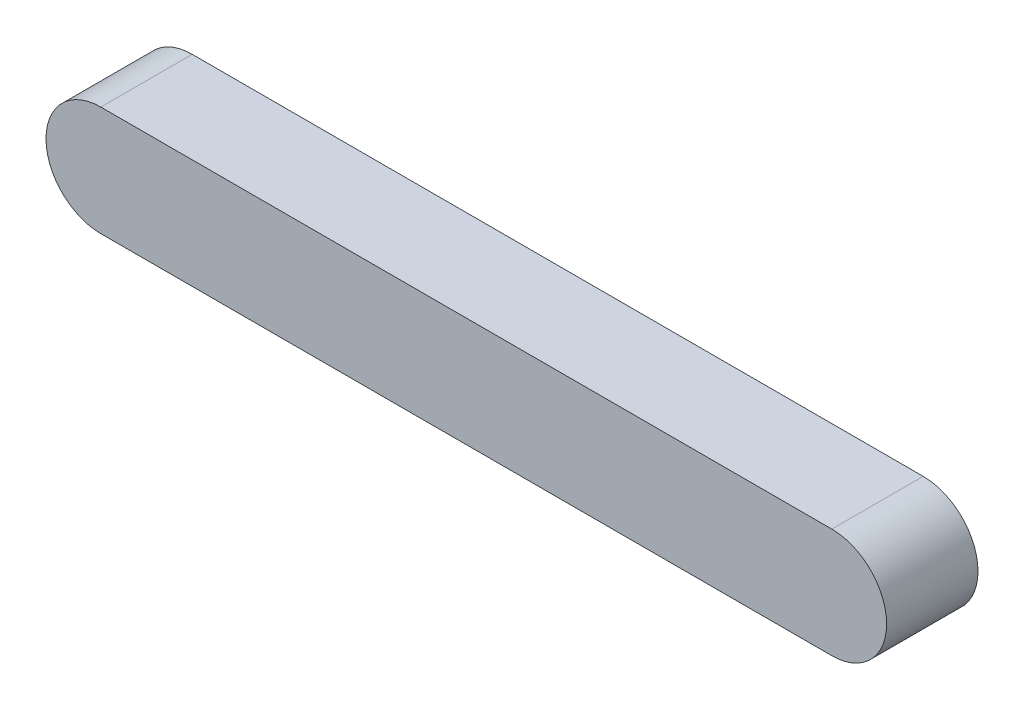
ISO-10303-21;
HEADER;
FILE_DESCRIPTION(('STEP AP214'),'2;1');
FILE_NAME('part.step','',(''),(''),'','','');
FILE_SCHEMA(('AUTOMOTIVE_DESIGN { 1 0 10303 214 1 1 1 1 }'));
ENDSEC;
DATA;
#1=APPLICATION_CONTEXT('core data for automotive mechanical design processes');
#2=APPLICATION_PROTOCOL_DEFINITION('international standard','automotive_design',2000,#1);
#3=PRODUCT_CONTEXT('',#1,'mechanical');
#4=PRODUCT('Part','Part','',(#3));
#5=PRODUCT_RELATED_PRODUCT_CATEGORY('part','',(#4));
#6=PRODUCT_DEFINITION_FORMATION('','',#4);
#7=PRODUCT_DEFINITION_CONTEXT('part definition',#1,'design');
#8=PRODUCT_DEFINITION('design','',#6,#7);
#9=PRODUCT_DEFINITION_SHAPE('','',#8);
#10=(LENGTH_UNIT() NAMED_UNIT(*) SI_UNIT(.MILLI.,.METRE.));
#11=(NAMED_UNIT(*) PLANE_ANGLE_UNIT() SI_UNIT($,.RADIAN.));
#12=(NAMED_UNIT(*) SI_UNIT($,.STERADIAN.) SOLID_ANGLE_UNIT());
#13=UNCERTAINTY_MEASURE_WITH_UNIT(LENGTH_MEASURE(1.E-05),#10,'distance_accuracy_value','');
#14=(GEOMETRIC_REPRESENTATION_CONTEXT(3) GLOBAL_UNCERTAINTY_ASSIGNED_CONTEXT((#13)) GLOBAL_UNIT_ASSIGNED_CONTEXT((#10,
#11,#12)) REPRESENTATION_CONTEXT('',''));
#15=CARTESIAN_POINT('',(0.,0.,0.));
#16=DIRECTION('',(0.,0.,1.));
#17=DIRECTION('',(1.,0.,0.));
#18=AXIS2_PLACEMENT_3D('',#15,#16,#17);
#19=CARTESIAN_POINT('',(0.,0.,5.));
#20=DIRECTION('',(0.,0.,-1.));
#21=DIRECTION('',(-1.,0.,0.));
#22=AXIS2_PLACEMENT_3D('',#19,#20,#21);
#23=CYLINDRICAL_SURFACE('',#22,3.);
#24=CARTESIAN_POINT('',(0.,0.,0.));
#25=DIRECTION('',(0.,0.,1.));
#26=DIRECTION('',(1.,0.,0.));
#27=AXIS2_PLACEMENT_3D('',#24,#25,#26);
#28=CIRCLE('',#27,3.);
#29=CARTESIAN_POINT('',(0.,3.,0.));
#30=VERTEX_POINT('',#29);
#31=CARTESIAN_POINT('',(0.,-3.,0.));
#32=VERTEX_POINT('',#31);
#33=EDGE_CURVE('E99',#30,#32,#28,.T.);
#34=ORIENTED_EDGE('',*,*,#33,.T.);
#35=DIRECTION('',(0.,0.,-1.));
#36=VECTOR('',#35,1.);
#37=CARTESIAN_POINT('',(0.,-3.,5.));
#38=LINE('',#37,#36);
#39=CARTESIAN_POINT('',(0.,-3.,5.));
#40=VERTEX_POINT('',#39);
#41=EDGE_CURVE('E11',#40,#32,#38,.T.);
#42=ORIENTED_EDGE('',*,*,#41,.F.);
#43=CARTESIAN_POINT('',(0.,0.,5.));
#44=DIRECTION('',(0.,0.,1.));
#45=DIRECTION('',(1.,0.,0.));
#46=AXIS2_PLACEMENT_3D('',#43,#44,#45);
#47=CIRCLE('',#46,3.);
#48=CARTESIAN_POINT('',(0.,3.,5.));
#49=VERTEX_POINT('',#48);
#50=EDGE_CURVE('E87',#49,#40,#47,.T.);
#51=ORIENTED_EDGE('',*,*,#50,.F.);
#52=DIRECTION('',(0.,0.,-1.));
#53=VECTOR('',#52,1.);
#54=CARTESIAN_POINT('',(0.,3.,5.));
#55=LINE('',#54,#53);
#56=EDGE_CURVE('E95',#49,#30,#55,.T.);
#57=ORIENTED_EDGE('',*,*,#56,.T.);
#58=EDGE_LOOP('',(#34,#42,#51,#57));
#59=FACE_BOUND('',#58,.T.);
#60=ADVANCED_FACE('F36',(#59),#23,.T.);
#61=CARTESIAN_POINT('',(0.,-3.,5.));
#62=DIRECTION('',(0.,1.,0.));
#63=DIRECTION('',(0.,0.,1.));
#64=AXIS2_PLACEMENT_3D('',#61,#62,#63);
#65=PLANE('',#64);
#66=DIRECTION('',(1.,0.,0.));
#67=VECTOR('',#66,1.);
#68=CARTESIAN_POINT('',(0.,-3.,0.));
#69=LINE('',#68,#67);
#70=CARTESIAN_POINT('',(40.,-3.,0.));
#71=VERTEX_POINT('',#70);
#72=EDGE_CURVE('E91',#32,#71,#69,.T.);
#73=ORIENTED_EDGE('',*,*,#72,.T.);
#74=DIRECTION('',(0.,0.,-1.));
#75=VECTOR('',#74,1.);
#76=CARTESIAN_POINT('',(40.,-3.,5.));
#77=LINE('',#76,#75);
#78=CARTESIAN_POINT('',(40.,-3.,5.));
#79=VERTEX_POINT('',#78);
#80=EDGE_CURVE('E44',#79,#71,#77,.T.);
#81=ORIENTED_EDGE('',*,*,#80,.F.);
#82=DIRECTION('',(1.,0.,0.));
#83=VECTOR('',#82,1.);
#84=CARTESIAN_POINT('',(0.,-3.,5.));
#85=LINE('',#84,#83);
#86=EDGE_CURVE('E82',#40,#79,#85,.T.);
#87=ORIENTED_EDGE('',*,*,#86,.F.);
#88=ORIENTED_EDGE('',*,*,#41,.T.);
#89=EDGE_LOOP('',(#73,#81,#87,#88));
#90=FACE_BOUND('',#89,.T.);
#91=ADVANCED_FACE('F90',(#90),#65,.F.);
#92=CARTESIAN_POINT('',(40.,0.,5.));
#93=DIRECTION('',(0.,0.,-1.));
#94=DIRECTION('',(-1.,0.,0.));
#95=AXIS2_PLACEMENT_3D('',#92,#93,#94);
#96=CYLINDRICAL_SURFACE('',#95,3.);
#97=CARTESIAN_POINT('',(40.,0.,0.));
#98=DIRECTION('',(0.,0.,1.));
#99=DIRECTION('',(1.,0.,0.));
#100=AXIS2_PLACEMENT_3D('',#97,#98,#99);
#101=CIRCLE('',#100,3.);
#102=CARTESIAN_POINT('',(40.,3.,0.));
#103=VERTEX_POINT('',#102);
#104=EDGE_CURVE('E69',#71,#103,#101,.T.);
#105=ORIENTED_EDGE('',*,*,#104,.T.);
#106=DIRECTION('',(0.,0.,-1.));
#107=VECTOR('',#106,1.);
#108=CARTESIAN_POINT('',(40.,3.,5.));
#109=LINE('',#108,#107);
#110=CARTESIAN_POINT('',(40.,3.,5.));
#111=VERTEX_POINT('',#110);
#112=EDGE_CURVE('E92',#111,#103,#109,.T.);
#113=ORIENTED_EDGE('',*,*,#112,.F.);
#114=CARTESIAN_POINT('',(40.,0.,5.));
#115=DIRECTION('',(0.,0.,1.));
#116=DIRECTION('',(1.,0.,0.));
#117=AXIS2_PLACEMENT_3D('',#114,#115,#116);
#118=CIRCLE('',#117,3.);
#119=EDGE_CURVE('E85',#79,#111,#118,.T.);
#120=ORIENTED_EDGE('',*,*,#119,.F.);
#121=ORIENTED_EDGE('',*,*,#80,.T.);
#122=EDGE_LOOP('',(#105,#113,#120,#121));
#123=FACE_BOUND('',#122,.T.);
#124=ADVANCED_FACE('F93',(#123),#96,.T.);
#125=CARTESIAN_POINT('',(0.,3.,5.));
#126=DIRECTION('',(0.,-1.,0.));
#127=DIRECTION('',(0.,0.,-1.));
#128=AXIS2_PLACEMENT_3D('',#125,#126,#127);
#129=PLANE('',#128);
#130=DIRECTION('',(-1.,0.,0.));
#131=VECTOR('',#130,1.);
#132=CARTESIAN_POINT('',(0.,3.,0.));
#133=LINE('',#132,#131);
#134=EDGE_CURVE('E75',#103,#30,#133,.T.);
#135=ORIENTED_EDGE('',*,*,#134,.T.);
#136=ORIENTED_EDGE('',*,*,#56,.F.);
#137=DIRECTION('',(-1.,0.,0.));
#138=VECTOR('',#137,1.);
#139=CARTESIAN_POINT('',(0.,3.,5.));
#140=LINE('',#139,#138);
#141=EDGE_CURVE('E52',#111,#49,#140,.T.);
#142=ORIENTED_EDGE('',*,*,#141,.F.);
#143=ORIENTED_EDGE('',*,*,#112,.T.);
#144=EDGE_LOOP('',(#135,#136,#142,#143));
#145=FACE_BOUND('',#144,.T.);
#146=ADVANCED_FACE('F106',(#145),#129,.F.);
#147=CARTESIAN_POINT('',(0.,0.,5.));
#148=DIRECTION('',(0.,0.,1.));
#149=DIRECTION('',(1.,0.,0.));
#150=AXIS2_PLACEMENT_3D('',#147,#148,#149);
#151=PLANE('',#150);
#152=ORIENTED_EDGE('',*,*,#50,.T.);
#153=ORIENTED_EDGE('',*,*,#86,.T.);
#154=ORIENTED_EDGE('',*,*,#119,.T.);
#155=ORIENTED_EDGE('',*,*,#141,.T.);
#156=EDGE_LOOP('',(#152,#153,#154,#155));
#157=FACE_BOUND('',#156,.T.);
#158=ADVANCED_FACE('F83',(#157),#151,.T.);
#159=CARTESIAN_POINT('',(0.,0.,0.));
#160=DIRECTION('',(0.,0.,1.));
#161=DIRECTION('',(1.,0.,0.));
#162=AXIS2_PLACEMENT_3D('',#159,#160,#161);
#163=PLANE('',#162);
#164=ORIENTED_EDGE('',*,*,#33,.F.);
#165=ORIENTED_EDGE('',*,*,#134,.F.);
#166=ORIENTED_EDGE('',*,*,#104,.F.);
#167=ORIENTED_EDGE('',*,*,#72,.F.);
#168=EDGE_LOOP('',(#164,#165,#166,#167));
#169=FACE_BOUND('',#168,.T.);
#170=ADVANCED_FACE('F109',(#169),#163,.F.);
#171=CLOSED_SHELL('',(#60,#91,#124,#146,#158,#170));
#172=MANIFOLD_SOLID_BREP('B2',#171);
#173=ADVANCED_BREP_SHAPE_REPRESENTATION('',(#18,#172),#14);
#174=SHAPE_DEFINITION_REPRESENTATION(#9,#173);
ENDSEC;
END-ISO-10303-21;
